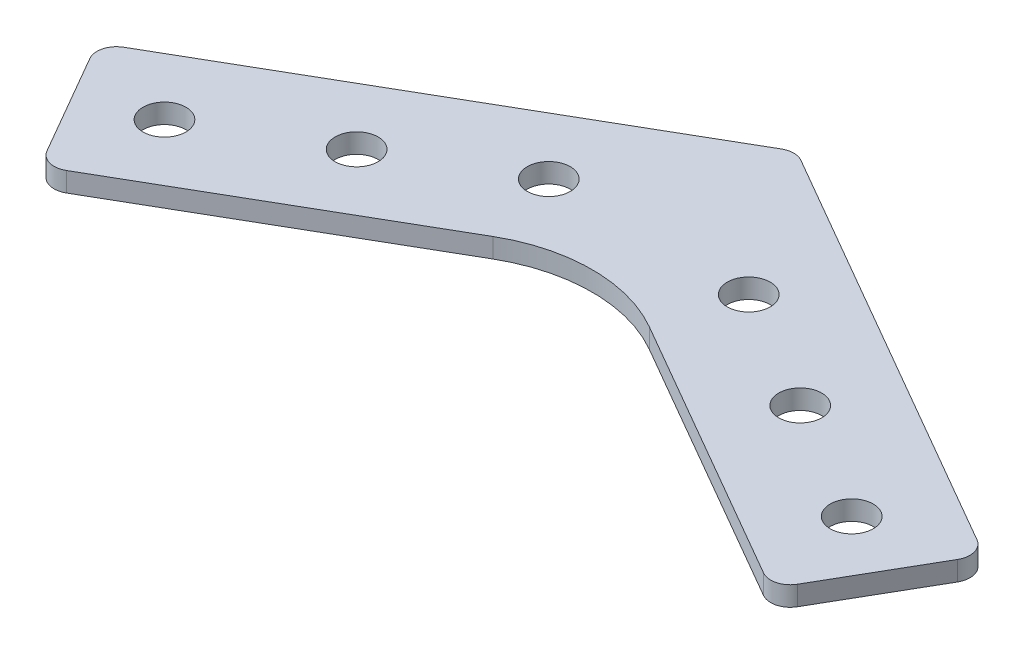
ISO-10303-21;
HEADER;
FILE_DESCRIPTION(('STEP AP214'),'2;1');
FILE_NAME('part.step','',(''),(''),'','','');
FILE_SCHEMA(('AUTOMOTIVE_DESIGN { 1 0 10303 214 1 1 1 1 }'));
ENDSEC;
DATA;
#1=APPLICATION_CONTEXT('core data for automotive mechanical design processes');
#2=APPLICATION_PROTOCOL_DEFINITION('international standard','automotive_design',2000,#1);
#3=PRODUCT_CONTEXT('',#1,'mechanical');
#4=PRODUCT('Part','Part','',(#3));
#5=PRODUCT_RELATED_PRODUCT_CATEGORY('part','',(#4));
#6=PRODUCT_DEFINITION_FORMATION('','',#4);
#7=PRODUCT_DEFINITION_CONTEXT('part definition',#1,'design');
#8=PRODUCT_DEFINITION('design','',#6,#7);
#9=PRODUCT_DEFINITION_SHAPE('','',#8);
#10=(LENGTH_UNIT() NAMED_UNIT(*) SI_UNIT(.MILLI.,.METRE.));
#11=(NAMED_UNIT(*) PLANE_ANGLE_UNIT() SI_UNIT($,.RADIAN.));
#12=(NAMED_UNIT(*) SI_UNIT($,.STERADIAN.) SOLID_ANGLE_UNIT());
#13=UNCERTAINTY_MEASURE_WITH_UNIT(LENGTH_MEASURE(1.E-05),#10,'distance_accuracy_value','');
#14=(GEOMETRIC_REPRESENTATION_CONTEXT(3) GLOBAL_UNCERTAINTY_ASSIGNED_CONTEXT((#13)) GLOBAL_UNIT_ASSIGNED_CONTEXT((#10,
#11,#12)) REPRESENTATION_CONTEXT('',''));
#15=CARTESIAN_POINT('',(0.,0.,0.));
#16=DIRECTION('',(0.,0.,1.));
#17=DIRECTION('',(1.,0.,0.));
#18=AXIS2_PLACEMENT_3D('',#15,#16,#17);
#19=CARTESIAN_POINT('',(-59.3920221915368,3.175,34.29));
#20=DIRECTION('',(-0.866025403784439,0.,0.5));
#21=DIRECTION('',(0.5,0.,0.866025403784439));
#22=AXIS2_PLACEMENT_3D('',#19,#20,#21);
#23=PLANE('',#22);
#24=DIRECTION('',(-0.5,0.,-0.866025403784439));
#25=VECTOR('',#24,1.);
#26=CARTESIAN_POINT('',(-59.3920221915368,0.,34.29));
#27=LINE('',#26,#25);
#28=CARTESIAN_POINT('',(-60.9795221915368,0.,31.5403693429844));
#29=VERTEX_POINT('',#28);
#30=CARTESIAN_POINT('',(-70.5045221915368,0.,15.0425854008909));
#31=VERTEX_POINT('',#30);
#32=EDGE_CURVE('E133',#29,#31,#27,.T.);
#33=ORIENTED_EDGE('',*,*,#32,.F.);
#34=DIRECTION('',(0.,-1.,0.));
#35=VECTOR('',#34,1.);
#36=CARTESIAN_POINT('',(-60.9795221915368,3.175,31.5403693429844));
#37=LINE('',#36,#35);
#38=CARTESIAN_POINT('',(-60.9795221915368,3.175,31.5403693429844));
#39=VERTEX_POINT('',#38);
#40=EDGE_CURVE('E141',#29,#39,#37,.F.);
#41=ORIENTED_EDGE('',*,*,#40,.T.);
#42=DIRECTION('',(-0.5,0.,-0.866025403784439));
#43=VECTOR('',#42,1.);
#44=CARTESIAN_POINT('',(-59.3920221915368,3.175,34.29));
#45=LINE('',#44,#43);
#46=CARTESIAN_POINT('',(-70.5045221915368,3.175,15.0425854008909));
#47=VERTEX_POINT('',#46);
#48=EDGE_CURVE('E219',#39,#47,#45,.T.);
#49=ORIENTED_EDGE('',*,*,#48,.T.);
#50=DIRECTION('',(0.,-1.,0.));
#51=VECTOR('',#50,1.);
#52=CARTESIAN_POINT('',(-70.5045221915368,3.175,15.0425854008909));
#53=LINE('',#52,#51);
#54=EDGE_CURVE('E142',#47,#31,#53,.T.);
#55=ORIENTED_EDGE('',*,*,#54,.T.);
#56=EDGE_LOOP('',(#33,#41,#49,#55));
#57=FACE_BOUND('',#56,.T.);
#58=ADVANCED_FACE('F40',(#57),#23,.T.);
#59=CARTESIAN_POINT('',(0.,3.175,0.));
#60=DIRECTION('',(0.5,0.,0.866025403784439));
#61=DIRECTION('',(0.866025403784439,0.,-0.5));
#62=AXIS2_PLACEMENT_3D('',#59,#60,#61);
#63=PLANE('',#62);
#64=DIRECTION('',(-0.866025403784439,0.,0.5));
#65=VECTOR('',#64,1.);
#66=CARTESIAN_POINT('',(0.,0.,0.));
#67=LINE('',#66,#65);
#68=CARTESIAN_POINT('',(-12.7,0.,7.33234841870827));
#69=VERTEX_POINT('',#68);
#70=CARTESIAN_POINT('',(-56.6423915345212,0.,32.7025));
#71=VERTEX_POINT('',#70);
#72=EDGE_CURVE('E124',#69,#71,#67,.T.);
#73=ORIENTED_EDGE('',*,*,#72,.F.);
#74=DIRECTION('',(0.,-1.,0.));
#75=VECTOR('',#74,1.);
#76=CARTESIAN_POINT('',(-12.7,3.175,7.33234841870827));
#77=LINE('',#76,#75);
#78=CARTESIAN_POINT('',(-12.7,3.175,7.33234841870827));
#79=VERTEX_POINT('',#78);
#80=EDGE_CURVE('E61',#69,#79,#77,.F.);
#81=ORIENTED_EDGE('',*,*,#80,.T.);
#82=DIRECTION('',(-0.866025403784439,0.,0.5));
#83=VECTOR('',#82,1.);
#84=CARTESIAN_POINT('',(0.,3.175,0.));
#85=LINE('',#84,#83);
#86=CARTESIAN_POINT('',(-56.6423915345212,3.175,32.7025));
#87=VERTEX_POINT('',#86);
#88=EDGE_CURVE('E146',#79,#87,#85,.T.);
#89=ORIENTED_EDGE('',*,*,#88,.T.);
#90=DIRECTION('',(0.,-1.,0.));
#91=VECTOR('',#90,1.);
#92=CARTESIAN_POINT('',(-56.6423915345212,3.175,32.7025));
#93=LINE('',#92,#91);
#94=EDGE_CURVE('E140',#87,#71,#93,.T.);
#95=ORIENTED_EDGE('',*,*,#94,.T.);
#96=EDGE_LOOP('',(#73,#81,#89,#95));
#97=FACE_BOUND('',#96,.T.);
#98=ADVANCED_FACE('F145',(#97),#63,.T.);
#99=CARTESIAN_POINT('',(59.3920221915367,3.175,34.2900000000001));
#100=DIRECTION('',(-0.500000000000002,0.,0.866025403784437));
#101=DIRECTION('',(0.866025403784438,0.,0.500000000000002));
#102=AXIS2_PLACEMENT_3D('',#99,#100,#101);
#103=PLANE('',#102);
#104=DIRECTION('',(-0.866025403784438,0.,-0.500000000000002));
#105=VECTOR('',#104,1.);
#106=CARTESIAN_POINT('',(59.3920221915367,3.175,34.2900000000001));
#107=LINE('',#106,#105);
#108=CARTESIAN_POINT('',(56.6423915345211,3.175,32.7025000000001));
#109=VERTEX_POINT('',#108);
#110=CARTESIAN_POINT('',(12.7,3.175,7.33234841870829));
#111=VERTEX_POINT('',#110);
#112=EDGE_CURVE('E205',#109,#111,#107,.T.);
#113=ORIENTED_EDGE('',*,*,#112,.T.);
#114=DIRECTION('',(0.,-1.,0.));
#115=VECTOR('',#114,1.);
#116=CARTESIAN_POINT('',(12.7,0.,7.33234841870829));
#117=LINE('',#116,#115);
#118=CARTESIAN_POINT('',(12.7,0.,7.33234841870829));
#119=VERTEX_POINT('',#118);
#120=EDGE_CURVE('E195',#111,#119,#117,.T.);
#121=ORIENTED_EDGE('',*,*,#120,.T.);
#122=DIRECTION('',(-0.866025403784438,0.,-0.500000000000002));
#123=VECTOR('',#122,1.);
#124=CARTESIAN_POINT('',(59.3920221915367,0.,34.2900000000001));
#125=LINE('',#124,#123);
#126=CARTESIAN_POINT('',(56.6423915345211,0.,32.7025000000001));
#127=VERTEX_POINT('',#126);
#128=EDGE_CURVE('E132',#127,#119,#125,.T.);
#129=ORIENTED_EDGE('',*,*,#128,.F.);
#130=DIRECTION('',(0.,-1.,0.));
#131=VECTOR('',#130,1.);
#132=CARTESIAN_POINT('',(56.6423915345211,3.175,32.7025000000001));
#133=LINE('',#132,#131);
#134=EDGE_CURVE('E184',#127,#109,#133,.F.);
#135=ORIENTED_EDGE('',*,*,#134,.T.);
#136=EDGE_LOOP('',(#113,#121,#129,#135));
#137=FACE_BOUND('',#136,.T.);
#138=ADVANCED_FACE('F202',(#137),#103,.T.);
#139=CARTESIAN_POINT('',(59.3920221915367,3.175,34.2900000000001));
#140=DIRECTION('',(-0.866025403784438,0.,-0.500000000000002));
#141=DIRECTION('',(-0.500000000000002,0.,0.866025403784438));
#142=AXIS2_PLACEMENT_3D('',#139,#140,#141);
#143=PLANE('',#142);
#144=DIRECTION('',(0.500000000000002,0.,-0.866025403784438));
#145=VECTOR('',#144,1.);
#146=CARTESIAN_POINT('',(59.3920221915367,0.,34.2900000000001));
#147=LINE('',#146,#145);
#148=CARTESIAN_POINT('',(60.9795221915367,0.,31.5403693429845));
#149=VERTEX_POINT('',#148);
#150=CARTESIAN_POINT('',(70.5045221915368,0.,15.042585400891));
#151=VERTEX_POINT('',#150);
#152=EDGE_CURVE('E209',#149,#151,#147,.T.);
#153=ORIENTED_EDGE('',*,*,#152,.T.);
#154=DIRECTION('',(0.,-1.,0.));
#155=VECTOR('',#154,1.);
#156=CARTESIAN_POINT('',(70.5045221915368,3.175,15.042585400891));
#157=LINE('',#156,#155);
#158=CARTESIAN_POINT('',(70.5045221915368,3.175,15.042585400891));
#159=VERTEX_POINT('',#158);
#160=EDGE_CURVE('E182',#151,#159,#157,.F.);
#161=ORIENTED_EDGE('',*,*,#160,.T.);
#162=DIRECTION('',(0.500000000000002,0.,-0.866025403784438));
#163=VECTOR('',#162,1.);
#164=CARTESIAN_POINT('',(59.3920221915367,3.175,34.2900000000001));
#165=LINE('',#164,#163);
#166=CARTESIAN_POINT('',(60.9795221915367,3.175,31.5403693429845));
#167=VERTEX_POINT('',#166);
#168=EDGE_CURVE('E154',#167,#159,#165,.T.);
#169=ORIENTED_EDGE('',*,*,#168,.F.);
#170=DIRECTION('',(0.,-1.,0.));
#171=VECTOR('',#170,1.);
#172=CARTESIAN_POINT('',(60.9795221915367,0.,31.5403693429845));
#173=LINE('',#172,#171);
#174=EDGE_CURVE('E179',#167,#149,#173,.T.);
#175=ORIENTED_EDGE('',*,*,#174,.T.);
#176=EDGE_LOOP('',(#153,#161,#169,#175));
#177=FACE_BOUND('',#176,.T.);
#178=ADVANCED_FACE('F338',(#177),#143,.F.);
#179=CARTESIAN_POINT('',(0.,3.175,-29.329393674833));
#180=DIRECTION('',(0.500000000000001,0.,-0.866025403784438));
#181=DIRECTION('',(-0.866025403784438,0.,-0.500000000000001));
#182=AXIS2_PLACEMENT_3D('',#179,#180,#181);
#183=PLANE('',#182);
#184=DIRECTION('',(0.866025403784438,0.,0.500000000000001));
#185=VECTOR('',#184,1.);
#186=CARTESIAN_POINT('',(0.,0.,-29.329393674833));
#187=LINE('',#186,#185);
#188=CARTESIAN_POINT('',(1.5875,0.,-28.4128501224945));
#189=VERTEX_POINT('',#188);
#190=CARTESIAN_POINT('',(69.3423915345212,0.,10.7054547438754));
#191=VERTEX_POINT('',#190);
#192=EDGE_CURVE('E212',#189,#191,#187,.T.);
#193=ORIENTED_EDGE('',*,*,#192,.F.);
#194=DIRECTION('',(0.,-1.,0.));
#195=VECTOR('',#194,1.);
#196=CARTESIAN_POINT('',(1.5875,3.175,-28.4128501224945));
#197=LINE('',#196,#195);
#198=CARTESIAN_POINT('',(1.58750000000003,3.175,-28.4128501224945));
#199=VERTEX_POINT('',#198);
#200=EDGE_CURVE('E191',#189,#199,#197,.F.);
#201=ORIENTED_EDGE('',*,*,#200,.T.);
#202=DIRECTION('',(-0.866025403784437,0.,-0.500000000000002));
#203=VECTOR('',#202,1.);
#204=CARTESIAN_POINT('',(72.0920221915368,3.175,12.2929547438754));
#205=LINE('',#204,#203);
#206=CARTESIAN_POINT('',(69.3423915345212,3.175,10.7054547438754));
#207=VERTEX_POINT('',#206);
#208=EDGE_CURVE('E149',#207,#199,#205,.T.);
#209=ORIENTED_EDGE('',*,*,#208,.F.);
#210=DIRECTION('',(0.,-1.,0.));
#211=VECTOR('',#210,1.);
#212=CARTESIAN_POINT('',(69.3423915345212,0.,10.7054547438754));
#213=LINE('',#212,#211);
#214=EDGE_CURVE('E176',#207,#191,#213,.T.);
#215=ORIENTED_EDGE('',*,*,#214,.T.);
#216=EDGE_LOOP('',(#193,#201,#209,#215));
#217=FACE_BOUND('',#216,.T.);
#218=ADVANCED_FACE('F340',(#217),#183,.T.);
#219=CARTESIAN_POINT('',(-25.3999999999999,3.175,-14.6646968374165));
#220=DIRECTION('',(-0.5,0.,-0.866025403784438));
#221=DIRECTION('',(-0.866025403784438,0.,0.5));
#222=AXIS2_PLACEMENT_3D('',#219,#220,#221);
#223=PLANE('',#222);
#224=DIRECTION('',(-0.866025403784439,0.,0.5));
#225=VECTOR('',#224,1.);
#226=CARTESIAN_POINT('',(-25.3999999999999,3.175,-14.6646968374165));
#227=LINE('',#226,#225);
#228=CARTESIAN_POINT('',(-1.5875,3.175,-28.4128501224944));
#229=VERTEX_POINT('',#228);
#230=CARTESIAN_POINT('',(-69.3423915345212,3.175,10.7054547438753));
#231=VERTEX_POINT('',#230);
#232=EDGE_CURVE('E217',#229,#231,#227,.T.);
#233=ORIENTED_EDGE('',*,*,#232,.F.);
#234=DIRECTION('',(0.,-1.,0.));
#235=VECTOR('',#234,1.);
#236=CARTESIAN_POINT('',(-1.5875,3.175,-28.4128501224945));
#237=LINE('',#236,#235);
#238=CARTESIAN_POINT('',(-1.58750000000001,0.,-28.4128501224945));
#239=VERTEX_POINT('',#238);
#240=EDGE_CURVE('E186',#229,#239,#237,.T.);
#241=ORIENTED_EDGE('',*,*,#240,.T.);
#242=DIRECTION('',(0.866025403784438,0.,-0.5));
#243=VECTOR('',#242,1.);
#244=CARTESIAN_POINT('',(-25.3999999999999,0.,-14.6646968374165));
#245=LINE('',#244,#243);
#246=CARTESIAN_POINT('',(-69.3423915345212,0.,10.7054547438753));
#247=VERTEX_POINT('',#246);
#248=EDGE_CURVE('E157',#247,#239,#245,.T.);
#249=ORIENTED_EDGE('',*,*,#248,.F.);
#250=DIRECTION('',(0.,-1.,0.));
#251=VECTOR('',#250,1.);
#252=CARTESIAN_POINT('',(-69.3423915345212,3.175,10.7054547438753));
#253=LINE('',#252,#251);
#254=EDGE_CURVE('E173',#247,#231,#253,.F.);
#255=ORIENTED_EDGE('',*,*,#254,.T.);
#256=EDGE_LOOP('',(#233,#241,#249,#255));
#257=FACE_BOUND('',#256,.T.);
#258=ADVANCED_FACE('F281',(#257),#223,.T.);
#259=CARTESIAN_POINT('',(0.,3.175,0.));
#260=DIRECTION('',(0.,-1.,0.));
#261=DIRECTION('',(0.,0.,-1.));
#262=AXIS2_PLACEMENT_3D('',#259,#260,#261);
#263=PLANE('',#262);
#264=CARTESIAN_POINT('',(36.0460110957684,3.175,6.14647737193771));
#265=DIRECTION('',(0.,1.,0.));
#266=DIRECTION('',(0.,0.,1.));
#267=AXIS2_PLACEMENT_3D('',#264,#265,#266);
#268=CIRCLE('',#267,3.4925);
#269=CARTESIAN_POINT('',(36.0460110957684,3.175,9.63897737193771));
#270=VERTEX_POINT('',#269);
#271=EDGE_CURVE('E263',#270,#270,#268,.T.);
#272=ORIENTED_EDGE('',*,*,#271,.F.);
#273=EDGE_LOOP('',(#272));
#274=FACE_BOUND('',#273,.T.);
#275=CARTESIAN_POINT('',(16.2486703652561,3.175,-5.28352262806232));
#276=DIRECTION('',(0.,1.,0.));
#277=DIRECTION('',(0.,0.,1.));
#278=AXIS2_PLACEMENT_3D('',#275,#276,#277);
#279=CIRCLE('',#278,3.4925);
#280=CARTESIAN_POINT('',(16.2486703652561,3.175,-1.79102262806232));
#281=VERTEX_POINT('',#280);
#282=EDGE_CURVE('E257',#281,#281,#279,.T.);
#283=ORIENTED_EDGE('',*,*,#282,.F.);
#284=EDGE_LOOP('',(#283));
#285=FACE_BOUND('',#284,.T.);
#286=CARTESIAN_POINT('',(55.8433518262806,3.175,17.5764773719378));
#287=DIRECTION('',(0.,1.,0.));
#288=DIRECTION('',(0.,0.,1.));
#289=AXIS2_PLACEMENT_3D('',#286,#287,#288);
#290=CIRCLE('',#289,3.4925);
#291=CARTESIAN_POINT('',(55.8433518262806,3.175,21.0689773719378));
#292=VERTEX_POINT('',#291);
#293=EDGE_CURVE('E251',#292,#292,#290,.T.);
#294=ORIENTED_EDGE('',*,*,#293,.F.);
#295=EDGE_LOOP('',(#294));
#296=FACE_BOUND('',#295,.T.);
#297=CARTESIAN_POINT('',(-36.0460110957684,3.175,6.14647737193764));
#298=DIRECTION('',(0.,1.,0.));
#299=DIRECTION('',(0.,0.,1.));
#300=AXIS2_PLACEMENT_3D('',#297,#298,#299);
#301=CIRCLE('',#300,3.4925);
#302=CARTESIAN_POINT('',(-36.0460110957684,3.175,9.63897737193764));
#303=VERTEX_POINT('',#302);
#304=EDGE_CURVE('E246',#303,#303,#301,.T.);
#305=ORIENTED_EDGE('',*,*,#304,.F.);
#306=EDGE_LOOP('',(#305));
#307=FACE_BOUND('',#306,.T.);
#308=CARTESIAN_POINT('',(-16.2486703652561,3.175,-5.28352262806237));
#309=DIRECTION('',(0.,1.,0.));
#310=DIRECTION('',(0.,0.,1.));
#311=AXIS2_PLACEMENT_3D('',#308,#309,#310);
#312=CIRCLE('',#311,3.4925);
#313=CARTESIAN_POINT('',(-16.2486703652561,3.175,-1.79102262806237));
#314=VERTEX_POINT('',#313);
#315=EDGE_CURVE('E239',#314,#314,#312,.T.);
#316=ORIENTED_EDGE('',*,*,#315,.F.);
#317=EDGE_LOOP('',(#316));
#318=FACE_BOUND('',#317,.T.);
#319=CARTESIAN_POINT('',(-55.8433518262807,3.175,17.5764773719376));
#320=DIRECTION('',(0.,1.,0.));
#321=DIRECTION('',(0.,0.,1.));
#322=AXIS2_PLACEMENT_3D('',#319,#320,#321);
#323=CIRCLE('',#322,3.4925);
#324=CARTESIAN_POINT('',(-55.8433518262807,3.175,21.0689773719376));
#325=VERTEX_POINT('',#324);
#326=EDGE_CURVE('E226',#325,#325,#323,.T.);
#327=ORIENTED_EDGE('',*,*,#326,.F.);
#328=EDGE_LOOP('',(#327));
#329=FACE_BOUND('',#328,.T.);
#330=ORIENTED_EDGE('',*,*,#208,.T.);
#331=CARTESIAN_POINT('',(0.,3.175,-25.6632194654789));
#332=DIRECTION('',(0.,-1.,0.));
#333=DIRECTION('',(0.,0.,-1.));
#334=AXIS2_PLACEMENT_3D('',#331,#332,#333);
#335=CIRCLE('',#334,3.175);
#336=EDGE_CURVE('E193',#199,#229,#335,.F.);
#337=ORIENTED_EDGE('',*,*,#336,.T.);
#338=ORIENTED_EDGE('',*,*,#232,.T.);
#339=CARTESIAN_POINT('',(-67.7548915345212,3.175,13.4550854008909));
#340=DIRECTION('',(0.,-1.,0.));
#341=DIRECTION('',(0.,0.,-1.));
#342=AXIS2_PLACEMENT_3D('',#339,#340,#341);
#343=CIRCLE('',#342,3.175);
#344=EDGE_CURVE('E169',#231,#47,#343,.F.);
#345=ORIENTED_EDGE('',*,*,#344,.T.);
#346=ORIENTED_EDGE('',*,*,#48,.F.);
#347=CARTESIAN_POINT('',(-58.2298915345212,3.175,29.9528693429844));
#348=DIRECTION('',(0.,-1.,0.));
#349=DIRECTION('',(0.,0.,-1.));
#350=AXIS2_PLACEMENT_3D('',#347,#348,#349);
#351=CIRCLE('',#350,3.175);
#352=EDGE_CURVE('E171',#39,#87,#351,.F.);
#353=ORIENTED_EDGE('',*,*,#352,.T.);
#354=ORIENTED_EDGE('',*,*,#88,.F.);
#355=CARTESIAN_POINT('',(0.,3.175,29.329393674833));
#356=DIRECTION('',(0.,-1.,0.));
#357=DIRECTION('',(0.,0.,-1.));
#358=AXIS2_PLACEMENT_3D('',#355,#356,#357);
#359=CIRCLE('',#358,25.4);
#360=EDGE_CURVE('E11',#79,#111,#359,.T.);
#361=ORIENTED_EDGE('',*,*,#360,.T.);
#362=ORIENTED_EDGE('',*,*,#112,.F.);
#363=CARTESIAN_POINT('',(58.2298915345211,3.175,29.9528693429845));
#364=DIRECTION('',(0.,-1.,0.));
#365=DIRECTION('',(0.,0.,-1.));
#366=AXIS2_PLACEMENT_3D('',#363,#364,#365);
#367=CIRCLE('',#366,3.175);
#368=EDGE_CURVE('E165',#109,#167,#367,.F.);
#369=ORIENTED_EDGE('',*,*,#368,.T.);
#370=ORIENTED_EDGE('',*,*,#168,.T.);
#371=CARTESIAN_POINT('',(67.7548915345212,3.175,13.455085400891));
#372=DIRECTION('',(0.,-1.,0.));
#373=DIRECTION('',(0.,0.,-1.));
#374=AXIS2_PLACEMENT_3D('',#371,#372,#373);
#375=CIRCLE('',#374,3.175);
#376=EDGE_CURVE('E167',#159,#207,#375,.F.);
#377=ORIENTED_EDGE('',*,*,#376,.T.);
#378=EDGE_LOOP('',(#330,#337,#338,#345,#346,#353,#354,#361,#362,#369,#370,#377));
#379=FACE_BOUND('',#378,.T.);
#380=ADVANCED_FACE('F278',(#274,#285,#296,#307,#318,#329,#379),#263,.F.);
#381=CARTESIAN_POINT('',(0.,0.,0.));
#382=DIRECTION('',(0.,-1.,0.));
#383=DIRECTION('',(0.,0.,-1.));
#384=AXIS2_PLACEMENT_3D('',#381,#382,#383);
#385=PLANE('',#384);
#386=CARTESIAN_POINT('',(36.0460110957684,0.,6.14647737193771));
#387=DIRECTION('',(0.,1.,0.));
#388=DIRECTION('',(0.,0.,1.));
#389=AXIS2_PLACEMENT_3D('',#386,#387,#388);
#390=CIRCLE('',#389,3.4925);
#391=CARTESIAN_POINT('',(36.0460110957684,0.,9.63897737193771));
#392=VERTEX_POINT('',#391);
#393=EDGE_CURVE('E254',#392,#392,#390,.T.);
#394=ORIENTED_EDGE('',*,*,#393,.T.);
#395=EDGE_LOOP('',(#394));
#396=FACE_BOUND('',#395,.T.);
#397=CARTESIAN_POINT('',(16.2486703652561,0.,-5.28352262806232));
#398=DIRECTION('',(0.,1.,0.));
#399=DIRECTION('',(0.,0.,1.));
#400=AXIS2_PLACEMENT_3D('',#397,#398,#399);
#401=CIRCLE('',#400,3.4925);
#402=CARTESIAN_POINT('',(16.2486703652561,0.,-1.79102262806232));
#403=VERTEX_POINT('',#402);
#404=EDGE_CURVE('E260',#403,#403,#401,.T.);
#405=ORIENTED_EDGE('',*,*,#404,.T.);
#406=EDGE_LOOP('',(#405));
#407=FACE_BOUND('',#406,.T.);
#408=CARTESIAN_POINT('',(55.8433518262806,0.,17.5764773719378));
#409=DIRECTION('',(0.,1.,0.));
#410=DIRECTION('',(0.,0.,1.));
#411=AXIS2_PLACEMENT_3D('',#408,#409,#410);
#412=CIRCLE('',#411,3.4925);
#413=CARTESIAN_POINT('',(55.8433518262806,0.,21.0689773719378));
#414=VERTEX_POINT('',#413);
#415=EDGE_CURVE('E243',#414,#414,#412,.T.);
#416=ORIENTED_EDGE('',*,*,#415,.T.);
#417=EDGE_LOOP('',(#416));
#418=FACE_BOUND('',#417,.T.);
#419=CARTESIAN_POINT('',(-36.0460110957684,0.,6.14647737193764));
#420=DIRECTION('',(0.,1.,0.));
#421=DIRECTION('',(0.,0.,1.));
#422=AXIS2_PLACEMENT_3D('',#419,#420,#421);
#423=CIRCLE('',#422,3.4925);
#424=CARTESIAN_POINT('',(-36.0460110957684,0.,9.63897737193764));
#425=VERTEX_POINT('',#424);
#426=EDGE_CURVE('E237',#425,#425,#423,.T.);
#427=ORIENTED_EDGE('',*,*,#426,.T.);
#428=EDGE_LOOP('',(#427));
#429=FACE_BOUND('',#428,.T.);
#430=CARTESIAN_POINT('',(-16.2486703652561,0.,-5.28352262806237));
#431=DIRECTION('',(0.,1.,0.));
#432=DIRECTION('',(0.,0.,1.));
#433=AXIS2_PLACEMENT_3D('',#430,#431,#432);
#434=CIRCLE('',#433,3.4925);
#435=CARTESIAN_POINT('',(-16.2486703652561,0.,-1.79102262806237));
#436=VERTEX_POINT('',#435);
#437=EDGE_CURVE('E242',#436,#436,#434,.T.);
#438=ORIENTED_EDGE('',*,*,#437,.T.);
#439=EDGE_LOOP('',(#438));
#440=FACE_BOUND('',#439,.T.);
#441=CARTESIAN_POINT('',(-55.8433518262807,0.,17.5764773719376));
#442=DIRECTION('',(0.,1.,0.));
#443=DIRECTION('',(0.,0.,1.));
#444=AXIS2_PLACEMENT_3D('',#441,#442,#443);
#445=CIRCLE('',#444,3.4925);
#446=CARTESIAN_POINT('',(-55.8433518262807,0.,21.0689773719376));
#447=VERTEX_POINT('',#446);
#448=EDGE_CURVE('E232',#447,#447,#445,.T.);
#449=ORIENTED_EDGE('',*,*,#448,.T.);
#450=EDGE_LOOP('',(#449));
#451=FACE_BOUND('',#450,.T.);
#452=ORIENTED_EDGE('',*,*,#248,.T.);
#453=CARTESIAN_POINT('',(0.,0.,-25.6632194654789));
#454=DIRECTION('',(0.,-1.,0.));
#455=DIRECTION('',(0.,0.,-1.));
#456=AXIS2_PLACEMENT_3D('',#453,#454,#455);
#457=CIRCLE('',#456,3.175);
#458=EDGE_CURVE('E189',#239,#189,#457,.T.);
#459=ORIENTED_EDGE('',*,*,#458,.T.);
#460=ORIENTED_EDGE('',*,*,#192,.T.);
#461=CARTESIAN_POINT('',(67.7548915345212,0.,13.455085400891));
#462=DIRECTION('',(0.,-1.,0.));
#463=DIRECTION('',(0.,0.,-1.));
#464=AXIS2_PLACEMENT_3D('',#461,#462,#463);
#465=CIRCLE('',#464,3.175);
#466=EDGE_CURVE('E151',#191,#151,#465,.T.);
#467=ORIENTED_EDGE('',*,*,#466,.T.);
#468=ORIENTED_EDGE('',*,*,#152,.F.);
#469=CARTESIAN_POINT('',(58.2298915345211,0.,29.9528693429845));
#470=DIRECTION('',(0.,-1.,0.));
#471=DIRECTION('',(0.,0.,-1.));
#472=AXIS2_PLACEMENT_3D('',#469,#470,#471);
#473=CIRCLE('',#472,3.175);
#474=EDGE_CURVE('E148',#149,#127,#473,.T.);
#475=ORIENTED_EDGE('',*,*,#474,.T.);
#476=ORIENTED_EDGE('',*,*,#128,.T.);
#477=CARTESIAN_POINT('',(0.,0.,29.329393674833));
#478=DIRECTION('',(0.,-1.,0.));
#479=DIRECTION('',(0.,0.,-1.));
#480=AXIS2_PLACEMENT_3D('',#477,#478,#479);
#481=CIRCLE('',#480,25.4);
#482=EDGE_CURVE('E48',#119,#69,#481,.F.);
#483=ORIENTED_EDGE('',*,*,#482,.T.);
#484=ORIENTED_EDGE('',*,*,#72,.T.);
#485=CARTESIAN_POINT('',(-58.2298915345212,0.,29.9528693429844));
#486=DIRECTION('',(0.,-1.,0.));
#487=DIRECTION('',(0.,0.,-1.));
#488=AXIS2_PLACEMENT_3D('',#485,#486,#487);
#489=CIRCLE('',#488,3.175);
#490=EDGE_CURVE('E129',#71,#29,#489,.T.);
#491=ORIENTED_EDGE('',*,*,#490,.T.);
#492=ORIENTED_EDGE('',*,*,#32,.T.);
#493=CARTESIAN_POINT('',(-67.7548915345212,0.,13.4550854008909));
#494=DIRECTION('',(0.,-1.,0.));
#495=DIRECTION('',(0.,0.,-1.));
#496=AXIS2_PLACEMENT_3D('',#493,#494,#495);
#497=CIRCLE('',#496,3.175);
#498=EDGE_CURVE('E143',#31,#247,#497,.T.);
#499=ORIENTED_EDGE('',*,*,#498,.T.);
#500=EDGE_LOOP('',(#452,#459,#460,#467,#468,#475,#476,#483,#484,#491,#492,#499));
#501=FACE_BOUND('',#500,.T.);
#502=ADVANCED_FACE('F127',(#396,#407,#418,#429,#440,#451,#501),#385,.T.);
#503=CARTESIAN_POINT('',(-55.8433518262807,0.,17.5764773719376));
#504=DIRECTION('',(0.,1.,0.));
#505=DIRECTION('',(0.,0.,1.));
#506=AXIS2_PLACEMENT_3D('',#503,#504,#505);
#507=CYLINDRICAL_SURFACE('',#506,3.4925);
#508=ORIENTED_EDGE('',*,*,#448,.F.);
#509=EDGE_LOOP('',(#508));
#510=FACE_BOUND('',#509,.T.);
#511=ORIENTED_EDGE('',*,*,#326,.T.);
#512=EDGE_LOOP('',(#511));
#513=FACE_BOUND('',#512,.T.);
#514=ADVANCED_FACE('F448',(#510,#513),#507,.F.);
#515=CARTESIAN_POINT('',(-16.2486703652561,0.,-5.28352262806237));
#516=DIRECTION('',(0.,1.,0.));
#517=DIRECTION('',(0.,0.,1.));
#518=AXIS2_PLACEMENT_3D('',#515,#516,#517);
#519=CYLINDRICAL_SURFACE('',#518,3.4925);
#520=ORIENTED_EDGE('',*,*,#437,.F.);
#521=EDGE_LOOP('',(#520));
#522=FACE_BOUND('',#521,.T.);
#523=ORIENTED_EDGE('',*,*,#315,.T.);
#524=EDGE_LOOP('',(#523));
#525=FACE_BOUND('',#524,.T.);
#526=ADVANCED_FACE('F456',(#522,#525),#519,.F.);
#527=CARTESIAN_POINT('',(-36.0460110957684,0.,6.14647737193764));
#528=DIRECTION('',(0.,1.,0.));
#529=DIRECTION('',(0.,0.,1.));
#530=AXIS2_PLACEMENT_3D('',#527,#528,#529);
#531=CYLINDRICAL_SURFACE('',#530,3.4925);
#532=ORIENTED_EDGE('',*,*,#426,.F.);
#533=EDGE_LOOP('',(#532));
#534=FACE_BOUND('',#533,.T.);
#535=ORIENTED_EDGE('',*,*,#304,.T.);
#536=EDGE_LOOP('',(#535));
#537=FACE_BOUND('',#536,.T.);
#538=ADVANCED_FACE('F466',(#534,#537),#531,.F.);
#539=CARTESIAN_POINT('',(55.8433518262806,0.,17.5764773719378));
#540=DIRECTION('',(0.,1.,0.));
#541=DIRECTION('',(0.,0.,1.));
#542=AXIS2_PLACEMENT_3D('',#539,#540,#541);
#543=CYLINDRICAL_SURFACE('',#542,3.4925);
#544=ORIENTED_EDGE('',*,*,#415,.F.);
#545=EDGE_LOOP('',(#544));
#546=FACE_BOUND('',#545,.T.);
#547=ORIENTED_EDGE('',*,*,#293,.T.);
#548=EDGE_LOOP('',(#547));
#549=FACE_BOUND('',#548,.T.);
#550=ADVANCED_FACE('F476',(#546,#549),#543,.F.);
#551=CARTESIAN_POINT('',(16.2486703652561,0.,-5.28352262806232));
#552=DIRECTION('',(0.,1.,0.));
#553=DIRECTION('',(0.,0.,1.));
#554=AXIS2_PLACEMENT_3D('',#551,#552,#553);
#555=CYLINDRICAL_SURFACE('',#554,3.4925);
#556=ORIENTED_EDGE('',*,*,#404,.F.);
#557=EDGE_LOOP('',(#556));
#558=FACE_BOUND('',#557,.T.);
#559=ORIENTED_EDGE('',*,*,#282,.T.);
#560=EDGE_LOOP('',(#559));
#561=FACE_BOUND('',#560,.T.);
#562=ADVANCED_FACE('F274',(#558,#561),#555,.F.);
#563=CARTESIAN_POINT('',(36.0460110957684,0.,6.14647737193771));
#564=DIRECTION('',(0.,1.,0.));
#565=DIRECTION('',(0.,0.,1.));
#566=AXIS2_PLACEMENT_3D('',#563,#564,#565);
#567=CYLINDRICAL_SURFACE('',#566,3.4925);
#568=ORIENTED_EDGE('',*,*,#393,.F.);
#569=EDGE_LOOP('',(#568));
#570=FACE_BOUND('',#569,.T.);
#571=ORIENTED_EDGE('',*,*,#271,.T.);
#572=EDGE_LOOP('',(#571));
#573=FACE_BOUND('',#572,.T.);
#574=ADVANCED_FACE('F271',(#570,#573),#567,.F.);
#575=CARTESIAN_POINT('',(-58.2298915345212,3.175,29.9528693429844));
#576=DIRECTION('',(0.,-1.,0.));
#577=DIRECTION('',(0.,0.,-1.));
#578=AXIS2_PLACEMENT_3D('',#575,#576,#577);
#579=CYLINDRICAL_SURFACE('',#578,3.175);
#580=ORIENTED_EDGE('',*,*,#352,.F.);
#581=ORIENTED_EDGE('',*,*,#40,.F.);
#582=ORIENTED_EDGE('',*,*,#490,.F.);
#583=ORIENTED_EDGE('',*,*,#94,.F.);
#584=EDGE_LOOP('',(#580,#581,#582,#583));
#585=FACE_BOUND('',#584,.T.);
#586=ADVANCED_FACE('F139',(#585),#579,.T.);
#587=CARTESIAN_POINT('',(-67.7548915345212,3.175,13.4550854008909));
#588=DIRECTION('',(0.,-1.,0.));
#589=DIRECTION('',(0.,0.,-1.));
#590=AXIS2_PLACEMENT_3D('',#587,#588,#589);
#591=CYLINDRICAL_SURFACE('',#590,3.175);
#592=ORIENTED_EDGE('',*,*,#344,.F.);
#593=ORIENTED_EDGE('',*,*,#254,.F.);
#594=ORIENTED_EDGE('',*,*,#498,.F.);
#595=ORIENTED_EDGE('',*,*,#54,.F.);
#596=EDGE_LOOP('',(#592,#593,#594,#595));
#597=FACE_BOUND('',#596,.T.);
#598=ADVANCED_FACE('F306',(#597),#591,.T.);
#599=CARTESIAN_POINT('',(67.7548915345212,3.175,13.455085400891));
#600=DIRECTION('',(0.,1.,0.));
#601=DIRECTION('',(0.,0.,1.));
#602=AXIS2_PLACEMENT_3D('',#599,#600,#601);
#603=CYLINDRICAL_SURFACE('',#602,3.175);
#604=ORIENTED_EDGE('',*,*,#376,.F.);
#605=ORIENTED_EDGE('',*,*,#160,.F.);
#606=ORIENTED_EDGE('',*,*,#466,.F.);
#607=ORIENTED_EDGE('',*,*,#214,.F.);
#608=EDGE_LOOP('',(#604,#605,#606,#607));
#609=FACE_BOUND('',#608,.T.);
#610=ADVANCED_FACE('F321',(#609),#603,.T.);
#611=CARTESIAN_POINT('',(58.2298915345211,3.175,29.9528693429845));
#612=DIRECTION('',(0.,1.,0.));
#613=DIRECTION('',(0.,0.,1.));
#614=AXIS2_PLACEMENT_3D('',#611,#612,#613);
#615=CYLINDRICAL_SURFACE('',#614,3.175);
#616=ORIENTED_EDGE('',*,*,#368,.F.);
#617=ORIENTED_EDGE('',*,*,#134,.F.);
#618=ORIENTED_EDGE('',*,*,#474,.F.);
#619=ORIENTED_EDGE('',*,*,#174,.F.);
#620=EDGE_LOOP('',(#616,#617,#618,#619));
#621=FACE_BOUND('',#620,.T.);
#622=ADVANCED_FACE('F324',(#621),#615,.T.);
#623=CARTESIAN_POINT('',(0.,3.175,-25.6632194654789));
#624=DIRECTION('',(0.,-1.,0.));
#625=DIRECTION('',(0.,0.,-1.));
#626=AXIS2_PLACEMENT_3D('',#623,#624,#625);
#627=CYLINDRICAL_SURFACE('',#626,3.175);
#628=ORIENTED_EDGE('',*,*,#336,.F.);
#629=ORIENTED_EDGE('',*,*,#200,.F.);
#630=ORIENTED_EDGE('',*,*,#458,.F.);
#631=ORIENTED_EDGE('',*,*,#240,.F.);
#632=EDGE_LOOP('',(#628,#629,#630,#631));
#633=FACE_BOUND('',#632,.T.);
#634=ADVANCED_FACE('F300',(#633),#627,.T.);
#635=CARTESIAN_POINT('',(0.,3.175,29.329393674833));
#636=DIRECTION('',(0.,1.,0.));
#637=DIRECTION('',(0.,0.,1.));
#638=AXIS2_PLACEMENT_3D('',#635,#636,#637);
#639=CYLINDRICAL_SURFACE('',#638,25.4);
#640=ORIENTED_EDGE('',*,*,#360,.F.);
#641=ORIENTED_EDGE('',*,*,#80,.F.);
#642=ORIENTED_EDGE('',*,*,#482,.F.);
#643=ORIENTED_EDGE('',*,*,#120,.F.);
#644=EDGE_LOOP('',(#640,#641,#642,#643));
#645=FACE_BOUND('',#644,.T.);
#646=ADVANCED_FACE('F42',(#645),#639,.F.);
#647=CLOSED_SHELL('',(#58,#98,#138,#178,#218,#258,#380,#502,#514,#526,#538,#550,#562,#574,#586,
#598,#610,#622,#634,#646));
#648=MANIFOLD_SOLID_BREP('B2',#647);
#649=ADVANCED_BREP_SHAPE_REPRESENTATION('',(#18,#648),#14);
#650=SHAPE_DEFINITION_REPRESENTATION(#9,#649);
ENDSEC;
END-ISO-10303-21;
